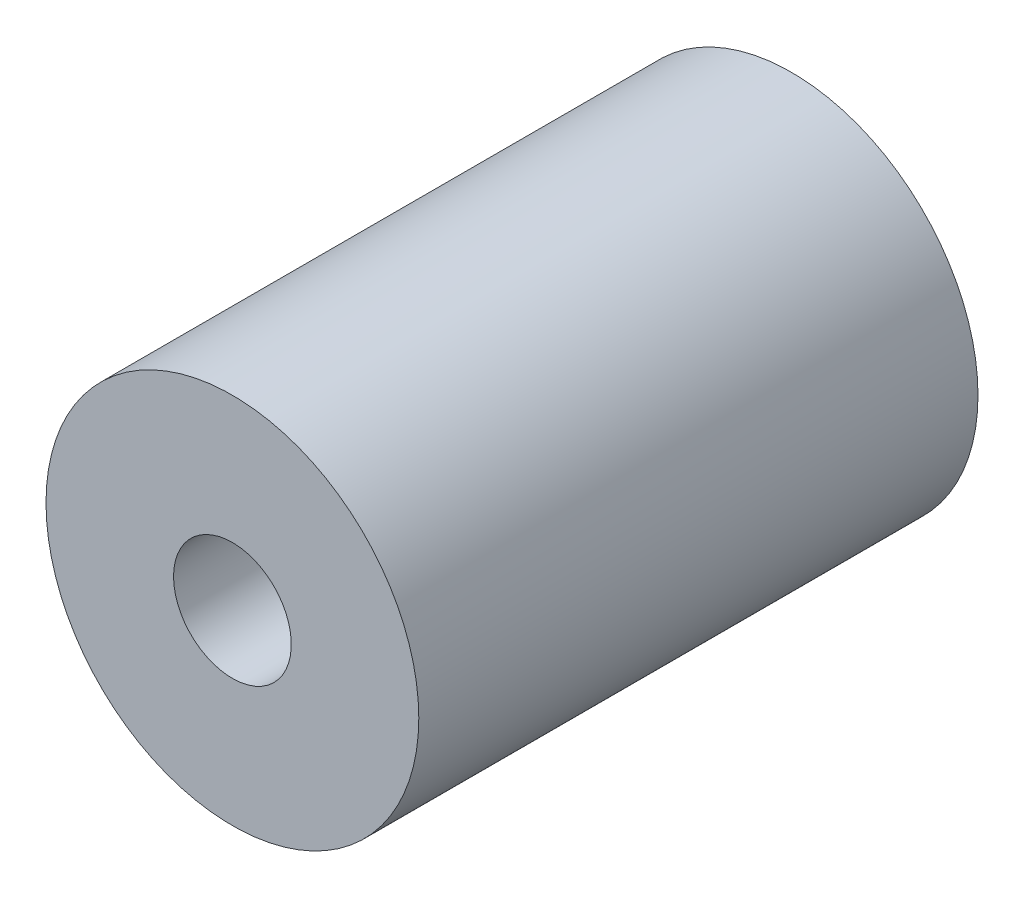
ISO-10303-21;
HEADER;
FILE_DESCRIPTION(('STEP AP214'),'2;1');
FILE_NAME('part.step','',(''),(''),'','','');
FILE_SCHEMA(('AUTOMOTIVE_DESIGN { 1 0 10303 214 1 1 1 1 }'));
ENDSEC;
DATA;
#1=APPLICATION_CONTEXT('core data for automotive mechanical design processes');
#2=APPLICATION_PROTOCOL_DEFINITION('international standard','automotive_design',2000,#1);
#3=PRODUCT_CONTEXT('',#1,'mechanical');
#4=PRODUCT('Part','Part','',(#3));
#5=PRODUCT_RELATED_PRODUCT_CATEGORY('part','',(#4));
#6=PRODUCT_DEFINITION_FORMATION('','',#4);
#7=PRODUCT_DEFINITION_CONTEXT('part definition',#1,'design');
#8=PRODUCT_DEFINITION('design','',#6,#7);
#9=PRODUCT_DEFINITION_SHAPE('','',#8);
#10=(LENGTH_UNIT() NAMED_UNIT(*) SI_UNIT(.MILLI.,.METRE.));
#11=(NAMED_UNIT(*) PLANE_ANGLE_UNIT() SI_UNIT($,.RADIAN.));
#12=(NAMED_UNIT(*) SI_UNIT($,.STERADIAN.) SOLID_ANGLE_UNIT());
#13=UNCERTAINTY_MEASURE_WITH_UNIT(LENGTH_MEASURE(1.E-05),#10,'distance_accuracy_value','');
#14=(GEOMETRIC_REPRESENTATION_CONTEXT(3) GLOBAL_UNCERTAINTY_ASSIGNED_CONTEXT((#13)) GLOBAL_UNIT_ASSIGNED_CONTEXT((#10,
#11,#12)) REPRESENTATION_CONTEXT('',''));
#15=CARTESIAN_POINT('',(0.,0.,0.));
#16=DIRECTION('',(0.,0.,1.));
#17=DIRECTION('',(1.,0.,0.));
#18=AXIS2_PLACEMENT_3D('',#15,#16,#17);
#19=CARTESIAN_POINT('',(0.,0.,28.5));
#20=DIRECTION('',(0.,0.,1.));
#21=DIRECTION('',(1.,0.,0.));
#22=AXIS2_PLACEMENT_3D('',#19,#20,#21);
#23=PLANE('',#22);
#24=CARTESIAN_POINT('',(0.,0.,28.5));
#25=DIRECTION('',(0.,0.,1.));
#26=DIRECTION('',(1.,0.,0.));
#27=AXIS2_PLACEMENT_3D('',#24,#25,#26);
#28=CIRCLE('',#27,19.);
#29=CARTESIAN_POINT('',(-19.,0.,28.5));
#30=VERTEX_POINT('',#29);
#31=EDGE_CURVE('E10',#30,#30,#28,.T.);
#32=ORIENTED_EDGE('',*,*,#31,.T.);
#33=EDGE_LOOP('',(#32));
#34=FACE_BOUND('',#33,.T.);
#35=CARTESIAN_POINT('',(0.,0.,28.5));
#36=DIRECTION('',(0.,0.,1.));
#37=DIRECTION('',(1.,0.,0.));
#38=AXIS2_PLACEMENT_3D('',#35,#36,#37);
#39=CIRCLE('',#38,6.);
#40=CARTESIAN_POINT('',(-6.,0.,28.5));
#41=VERTEX_POINT('',#40);
#42=EDGE_CURVE('E43',#41,#41,#39,.T.);
#43=ORIENTED_EDGE('',*,*,#42,.F.);
#44=EDGE_LOOP('',(#43));
#45=FACE_BOUND('',#44,.T.);
#46=ADVANCED_FACE('F32',(#34,#45),#23,.T.);
#47=CARTESIAN_POINT('',(0.,0.,-28.5));
#48=DIRECTION('',(0.,0.,1.));
#49=DIRECTION('',(1.,0.,0.));
#50=AXIS2_PLACEMENT_3D('',#47,#48,#49);
#51=PLANE('',#50);
#52=CARTESIAN_POINT('',(0.,0.,-28.5));
#53=DIRECTION('',(0.,0.,1.));
#54=DIRECTION('',(1.,0.,0.));
#55=AXIS2_PLACEMENT_3D('',#52,#53,#54);
#56=CIRCLE('',#55,19.);
#57=CARTESIAN_POINT('',(-19.,0.,-28.5));
#58=VERTEX_POINT('',#57);
#59=EDGE_CURVE('E36',#58,#58,#56,.T.);
#60=ORIENTED_EDGE('',*,*,#59,.F.);
#61=EDGE_LOOP('',(#60));
#62=FACE_BOUND('',#61,.T.);
#63=CARTESIAN_POINT('',(0.,0.,-28.5));
#64=DIRECTION('',(0.,0.,1.));
#65=DIRECTION('',(1.,0.,0.));
#66=AXIS2_PLACEMENT_3D('',#63,#64,#65);
#67=CIRCLE('',#66,6.);
#68=CARTESIAN_POINT('',(-6.,0.,-28.5));
#69=VERTEX_POINT('',#68);
#70=EDGE_CURVE('E45',#69,#69,#67,.T.);
#71=ORIENTED_EDGE('',*,*,#70,.T.);
#72=EDGE_LOOP('',(#71));
#73=FACE_BOUND('',#72,.T.);
#74=ADVANCED_FACE('F55',(#62,#73),#51,.F.);
#75=CARTESIAN_POINT('',(0.,0.,28.5));
#76=DIRECTION('',(0.,0.,-1.));
#77=DIRECTION('',(-1.,0.,0.));
#78=AXIS2_PLACEMENT_3D('',#75,#76,#77);
#79=CYLINDRICAL_SURFACE('',#78,19.);
#80=CARTESIAN_POINT('',(-19.,0.,28.5));
#81=CARTESIAN_POINT('',(-19.,0.,27.90625));
#82=CARTESIAN_POINT('',(-19.,0.,27.3125));
#83=CARTESIAN_POINT('',(-19.,0.,26.125));
#84=CARTESIAN_POINT('',(-19.,0.,25.53125));
#85=CARTESIAN_POINT('',(-19.,0.,24.34375));
#86=CARTESIAN_POINT('',(-19.,0.,23.75));
#87=CARTESIAN_POINT('',(-19.,0.,22.5625));
#88=CARTESIAN_POINT('',(-19.,0.,21.96875));
#89=CARTESIAN_POINT('',(-19.,0.,20.78125));
#90=CARTESIAN_POINT('',(-19.,0.,20.1875));
#91=CARTESIAN_POINT('',(-19.,0.,19.));
#92=CARTESIAN_POINT('',(-19.,0.,18.40625));
#93=CARTESIAN_POINT('',(-19.,0.,17.21875));
#94=CARTESIAN_POINT('',(-19.,0.,16.625));
#95=CARTESIAN_POINT('',(-19.,0.,15.4375));
#96=CARTESIAN_POINT('',(-19.,0.,14.84375));
#97=CARTESIAN_POINT('',(-19.,0.,13.65625));
#98=CARTESIAN_POINT('',(-19.,0.,13.0625));
#99=CARTESIAN_POINT('',(-19.,0.,11.875));
#100=CARTESIAN_POINT('',(-19.,0.,11.28125));
#101=CARTESIAN_POINT('',(-19.,0.,10.09375));
#102=CARTESIAN_POINT('',(-19.,0.,9.5));
#103=CARTESIAN_POINT('',(-19.,0.,8.3125));
#104=CARTESIAN_POINT('',(-19.,0.,7.71875));
#105=CARTESIAN_POINT('',(-19.,0.,6.53125));
#106=CARTESIAN_POINT('',(-19.,0.,5.9375));
#107=CARTESIAN_POINT('',(-19.,0.,4.75));
#108=CARTESIAN_POINT('',(-19.,0.,4.15625));
#109=CARTESIAN_POINT('',(-19.,0.,2.96875));
#110=CARTESIAN_POINT('',(-19.,0.,2.375));
#111=CARTESIAN_POINT('',(-19.,0.,1.1875));
#112=CARTESIAN_POINT('',(-19.,0.,0.593749999999997));
#113=CARTESIAN_POINT('',(-19.,0.,-0.593750000000004));
#114=CARTESIAN_POINT('',(-19.,0.,-1.1875));
#115=CARTESIAN_POINT('',(-19.,0.,-2.375));
#116=CARTESIAN_POINT('',(-19.,0.,-2.96875));
#117=CARTESIAN_POINT('',(-19.,0.,-4.15625));
#118=CARTESIAN_POINT('',(-19.,0.,-4.75));
#119=CARTESIAN_POINT('',(-19.,0.,-5.9375));
#120=CARTESIAN_POINT('',(-19.,0.,-6.53125));
#121=CARTESIAN_POINT('',(-19.,0.,-7.71875));
#122=CARTESIAN_POINT('',(-19.,0.,-8.3125));
#123=CARTESIAN_POINT('',(-19.,0.,-9.5));
#124=CARTESIAN_POINT('',(-19.,0.,-10.09375));
#125=CARTESIAN_POINT('',(-19.,0.,-11.28125));
#126=CARTESIAN_POINT('',(-19.,0.,-11.875));
#127=CARTESIAN_POINT('',(-19.,0.,-13.0625));
#128=CARTESIAN_POINT('',(-19.,0.,-13.65625));
#129=CARTESIAN_POINT('',(-19.,0.,-14.84375));
#130=CARTESIAN_POINT('',(-19.,0.,-15.4375));
#131=CARTESIAN_POINT('',(-19.,0.,-16.625));
#132=CARTESIAN_POINT('',(-19.,0.,-17.21875));
#133=CARTESIAN_POINT('',(-19.,0.,-18.40625));
#134=CARTESIAN_POINT('',(-19.,0.,-19.));
#135=CARTESIAN_POINT('',(-19.,0.,-20.1875));
#136=CARTESIAN_POINT('',(-19.,0.,-20.78125));
#137=CARTESIAN_POINT('',(-19.,0.,-21.96875));
#138=CARTESIAN_POINT('',(-19.,0.,-22.5625));
#139=CARTESIAN_POINT('',(-19.,0.,-23.75));
#140=CARTESIAN_POINT('',(-19.,0.,-24.34375));
#141=CARTESIAN_POINT('',(-19.,0.,-25.53125));
#142=CARTESIAN_POINT('',(-19.,0.,-26.125));
#143=CARTESIAN_POINT('',(-19.,0.,-27.3125));
#144=CARTESIAN_POINT('',(-19.,0.,-27.90625));
#145=CARTESIAN_POINT('',(-19.,0.,-28.5));
#146=B_SPLINE_CURVE_WITH_KNOTS('',3,(#80,#81,#82,#83,#84,#85,#86,#87,#88,#89,#90,#91,#92,#93,
#94,#95,#96,#97,#98,#99,#100,#101,#102,#103,#104,#105,#106,#107,#108,#109,#110,#111,#112,#113,
#114,#115,#116,#117,#118,#119,#120,#121,#122,#123,#124,#125,#126,#127,#128,#129,#130,#131,#132,
#133,#134,#135,#136,#137,#138,#139,#140,#141,#142,#143,#144,#145),.UNSPECIFIED.,.F.,.F.,(4,2,2,
2,2,2,2,2,2,2,2,2,2,2,2,2,2,2,2,2,2,2,2,2,2,2,2,2,2,2,2,2,4),(0.,1.78125,3.5625,5.34375,7.125,
8.90625,10.6875,12.46875,14.25,16.03125,17.8125,19.59375,21.375,23.15625,24.9375,26.71875,28.5,
30.28125,32.0625,33.84375,35.625,37.40625,39.1875,40.96875,42.75,44.53125,46.3125,48.09375,
49.875,51.65625,53.4375,55.21875,57.),.UNSPECIFIED.);
#147=EDGE_CURVE('BSEAM34',#30,#58,#146,.T.);
#148=ORIENTED_EDGE('',*,*,#31,.F.);
#149=ORIENTED_EDGE('',*,*,#59,.T.);
#150=ORIENTED_EDGE('',*,*,#147,.T.);
#151=ORIENTED_EDGE('',*,*,#147,.F.);
#152=EDGE_LOOP('',(#148,#150,#149,#151));
#153=FACE_BOUND('',#152,.T.);
#154=ADVANCED_FACE('F34',(#153),#79,.T.);
#155=CARTESIAN_POINT('',(0.,0.,28.5));
#156=DIRECTION('',(0.,0.,-1.));
#157=DIRECTION('',(-1.,0.,0.));
#158=AXIS2_PLACEMENT_3D('',#155,#156,#157);
#159=CYLINDRICAL_SURFACE('',#158,6.);
#160=CARTESIAN_POINT('',(-6.,0.,28.5));
#161=CARTESIAN_POINT('',(-6.,0.,27.90625));
#162=CARTESIAN_POINT('',(-6.,0.,27.3125));
#163=CARTESIAN_POINT('',(-6.,0.,26.125));
#164=CARTESIAN_POINT('',(-6.,0.,25.53125));
#165=CARTESIAN_POINT('',(-6.,0.,24.34375));
#166=CARTESIAN_POINT('',(-6.,0.,23.75));
#167=CARTESIAN_POINT('',(-6.,0.,22.5625));
#168=CARTESIAN_POINT('',(-6.,0.,21.96875));
#169=CARTESIAN_POINT('',(-6.,0.,20.78125));
#170=CARTESIAN_POINT('',(-6.,0.,20.1875));
#171=CARTESIAN_POINT('',(-6.,0.,19.));
#172=CARTESIAN_POINT('',(-6.,0.,18.40625));
#173=CARTESIAN_POINT('',(-6.,0.,17.21875));
#174=CARTESIAN_POINT('',(-6.,0.,16.625));
#175=CARTESIAN_POINT('',(-6.,0.,15.4375));
#176=CARTESIAN_POINT('',(-6.,0.,14.84375));
#177=CARTESIAN_POINT('',(-6.,0.,13.65625));
#178=CARTESIAN_POINT('',(-6.,0.,13.0625));
#179=CARTESIAN_POINT('',(-6.,0.,11.875));
#180=CARTESIAN_POINT('',(-6.,0.,11.28125));
#181=CARTESIAN_POINT('',(-6.,0.,10.09375));
#182=CARTESIAN_POINT('',(-6.,0.,9.5));
#183=CARTESIAN_POINT('',(-6.,0.,8.3125));
#184=CARTESIAN_POINT('',(-6.,0.,7.71875));
#185=CARTESIAN_POINT('',(-6.,0.,6.53125));
#186=CARTESIAN_POINT('',(-6.,0.,5.9375));
#187=CARTESIAN_POINT('',(-6.,0.,4.75));
#188=CARTESIAN_POINT('',(-6.,0.,4.15625));
#189=CARTESIAN_POINT('',(-6.,0.,2.96875));
#190=CARTESIAN_POINT('',(-6.,0.,2.375));
#191=CARTESIAN_POINT('',(-6.,0.,1.1875));
#192=CARTESIAN_POINT('',(-6.,0.,0.593750000000001));
#193=CARTESIAN_POINT('',(-6.,0.,-0.593750000000001));
#194=CARTESIAN_POINT('',(-6.,0.,-1.1875));
#195=CARTESIAN_POINT('',(-6.,0.,-2.375));
#196=CARTESIAN_POINT('',(-6.,0.,-2.96875));
#197=CARTESIAN_POINT('',(-6.,0.,-4.15625));
#198=CARTESIAN_POINT('',(-6.,0.,-4.75));
#199=CARTESIAN_POINT('',(-6.,0.,-5.9375));
#200=CARTESIAN_POINT('',(-6.,0.,-6.53125));
#201=CARTESIAN_POINT('',(-6.,0.,-7.71875));
#202=CARTESIAN_POINT('',(-6.,0.,-8.3125));
#203=CARTESIAN_POINT('',(-6.,0.,-9.5));
#204=CARTESIAN_POINT('',(-6.,0.,-10.09375));
#205=CARTESIAN_POINT('',(-6.,0.,-11.28125));
#206=CARTESIAN_POINT('',(-6.,0.,-11.875));
#207=CARTESIAN_POINT('',(-6.,0.,-13.0625));
#208=CARTESIAN_POINT('',(-6.,0.,-13.65625));
#209=CARTESIAN_POINT('',(-6.,0.,-14.84375));
#210=CARTESIAN_POINT('',(-6.,0.,-15.4375));
#211=CARTESIAN_POINT('',(-6.,0.,-16.625));
#212=CARTESIAN_POINT('',(-6.,0.,-17.21875));
#213=CARTESIAN_POINT('',(-6.,0.,-18.40625));
#214=CARTESIAN_POINT('',(-6.,0.,-19.));
#215=CARTESIAN_POINT('',(-6.,0.,-20.1875));
#216=CARTESIAN_POINT('',(-6.,0.,-20.78125));
#217=CARTESIAN_POINT('',(-6.,0.,-21.96875));
#218=CARTESIAN_POINT('',(-6.,0.,-22.5625));
#219=CARTESIAN_POINT('',(-6.,0.,-23.75));
#220=CARTESIAN_POINT('',(-6.,0.,-24.34375));
#221=CARTESIAN_POINT('',(-6.,0.,-25.53125));
#222=CARTESIAN_POINT('',(-6.,0.,-26.125));
#223=CARTESIAN_POINT('',(-6.,0.,-27.3125));
#224=CARTESIAN_POINT('',(-6.,0.,-27.90625));
#225=CARTESIAN_POINT('',(-6.,0.,-28.5));
#226=B_SPLINE_CURVE_WITH_KNOTS('',3,(#160,#161,#162,#163,#164,#165,#166,#167,#168,#169,#170,
#171,#172,#173,#174,#175,#176,#177,#178,#179,#180,#181,#182,#183,#184,#185,#186,#187,#188,#189,
#190,#191,#192,#193,#194,#195,#196,#197,#198,#199,#200,#201,#202,#203,#204,#205,#206,#207,#208,
#209,#210,#211,#212,#213,#214,#215,#216,#217,#218,#219,#220,#221,#222,#223,#224,#225),
.UNSPECIFIED.,.F.,.F.,(4,2,2,2,2,2,2,2,2,2,2,2,2,2,2,2,2,2,2,2,2,2,2,2,2,2,2,2,2,2,2,2,4),(0.,
1.78125,3.5625,5.34375,7.125,8.90625,10.6875,12.46875,14.25,16.03125,17.8125,19.59375,21.375,
23.15625,24.9375,26.71875,28.5,30.28125,32.0625,33.84375,35.625,37.40625,39.1875,40.96875,42.75,
44.53125,46.3125,48.09375,49.875,51.65625,53.4375,55.21875,57.),.UNSPECIFIED.);
#227=EDGE_CURVE('BSEAM51',#41,#69,#226,.T.);
#228=ORIENTED_EDGE('',*,*,#42,.T.);
#229=ORIENTED_EDGE('',*,*,#70,.F.);
#230=ORIENTED_EDGE('',*,*,#227,.T.);
#231=ORIENTED_EDGE('',*,*,#227,.F.);
#232=EDGE_LOOP('',(#228,#230,#229,#231));
#233=FACE_BOUND('',#232,.T.);
#234=ADVANCED_FACE('F51',(#233),#159,.F.);
#235=CLOSED_SHELL('',(#46,#74,#154,#234));
#236=MANIFOLD_SOLID_BREP('B2',#235);
#237=ADVANCED_BREP_SHAPE_REPRESENTATION('',(#18,#236),#14);
#238=SHAPE_DEFINITION_REPRESENTATION(#9,#237);
ENDSEC;
END-ISO-10303-21;
